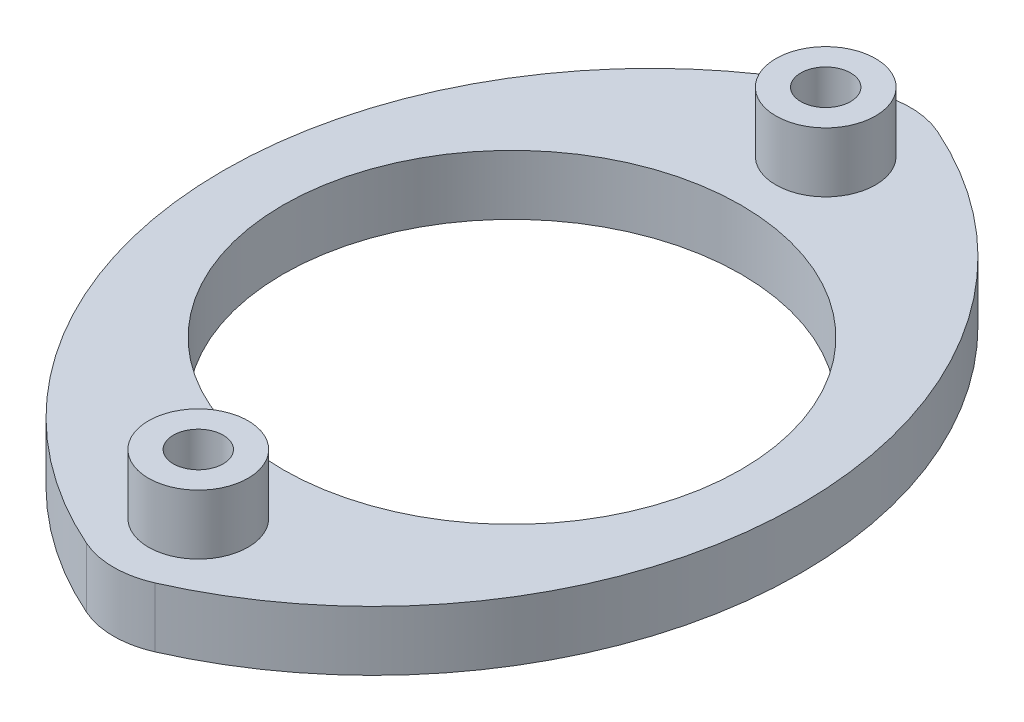
ISO-10303-21;
HEADER;
FILE_DESCRIPTION(('STEP AP214'),'2;1');
FILE_NAME('part.step','',(''),(''),'','','');
FILE_SCHEMA(('AUTOMOTIVE_DESIGN { 1 0 10303 214 1 1 1 1 }'));
ENDSEC;
DATA;
#1=APPLICATION_CONTEXT('core data for automotive mechanical design processes');
#2=APPLICATION_PROTOCOL_DEFINITION('international standard','automotive_design',2000,#1);
#3=PRODUCT_CONTEXT('',#1,'mechanical');
#4=PRODUCT('Part','Part','',(#3));
#5=PRODUCT_RELATED_PRODUCT_CATEGORY('part','',(#4));
#6=PRODUCT_DEFINITION_FORMATION('','',#4);
#7=PRODUCT_DEFINITION_CONTEXT('part definition',#1,'design');
#8=PRODUCT_DEFINITION('design','',#6,#7);
#9=PRODUCT_DEFINITION_SHAPE('','',#8);
#10=(LENGTH_UNIT() NAMED_UNIT(*) SI_UNIT(.MILLI.,.METRE.));
#11=(NAMED_UNIT(*) PLANE_ANGLE_UNIT() SI_UNIT($,.RADIAN.));
#12=(NAMED_UNIT(*) SI_UNIT($,.STERADIAN.) SOLID_ANGLE_UNIT());
#13=UNCERTAINTY_MEASURE_WITH_UNIT(LENGTH_MEASURE(1.E-05),#10,'distance_accuracy_value','');
#14=(GEOMETRIC_REPRESENTATION_CONTEXT(3) GLOBAL_UNCERTAINTY_ASSIGNED_CONTEXT((#13)) GLOBAL_UNIT_ASSIGNED_CONTEXT((#10,
#11,#12)) REPRESENTATION_CONTEXT('',''));
#15=CARTESIAN_POINT('',(0.,0.,0.));
#16=DIRECTION('',(0.,0.,1.));
#17=DIRECTION('',(1.,0.,0.));
#18=AXIS2_PLACEMENT_3D('',#15,#16,#17);
#19=CARTESIAN_POINT('',(0.,3.,0.));
#20=DIRECTION('',(0.,1.,0.));
#21=DIRECTION('',(0.,0.,1.));
#22=AXIS2_PLACEMENT_3D('',#19,#20,#21);
#23=PLANE('',#22);
#24=CARTESIAN_POINT('',(0.,3.,-15.75));
#25=DIRECTION('',(0.,1.,0.));
#26=DIRECTION('',(0.,0.,1.));
#27=AXIS2_PLACEMENT_3D('',#24,#25,#26);
#28=CIRCLE('',#27,2.5);
#29=CARTESIAN_POINT('',(0.,3.,-13.25));
#30=VERTEX_POINT('',#29);
#31=EDGE_CURVE('E104',#30,#30,#28,.F.);
#32=ORIENTED_EDGE('',*,*,#31,.T.);
#33=EDGE_LOOP('',(#32));
#34=FACE_BOUND('',#33,.T.);
#35=CARTESIAN_POINT('',(-6.97560975609756,3.,0.));
#36=DIRECTION('',(0.,1.,0.));
#37=DIRECTION('',(0.,0.,1.));
#38=AXIS2_PLACEMENT_3D('',#35,#36,#37);
#39=CIRCLE('',#38,21.4756097560976);
#40=CARTESIAN_POINT('',(1.72106194690265,3.,-19.6359292035398));
#41=VERTEX_POINT('',#40);
#42=CARTESIAN_POINT('',(1.72106194690265,3.,19.6359292035398));
#43=VERTEX_POINT('',#42);
#44=EDGE_CURVE('E84',#41,#43,#39,.F.);
#45=ORIENTED_EDGE('',*,*,#44,.F.);
#46=CARTESIAN_POINT('',(0.,3.,-15.75));
#47=DIRECTION('',(0.,1.,0.));
#48=DIRECTION('',(0.,0.,1.));
#49=AXIS2_PLACEMENT_3D('',#46,#47,#48);
#50=CIRCLE('',#49,4.25);
#51=CARTESIAN_POINT('',(-1.72106194690265,3.,-19.6359292035398));
#52=VERTEX_POINT('',#51);
#53=EDGE_CURVE('E78',#41,#52,#50,.T.);
#54=ORIENTED_EDGE('',*,*,#53,.T.);
#55=CARTESIAN_POINT('',(6.97560975609756,3.,0.));
#56=DIRECTION('',(0.,1.,0.));
#57=DIRECTION('',(0.,0.,1.));
#58=AXIS2_PLACEMENT_3D('',#55,#56,#57);
#59=CIRCLE('',#58,21.4756097560976);
#60=CARTESIAN_POINT('',(-1.72106194690266,3.,19.6359292035398));
#61=VERTEX_POINT('',#60);
#62=EDGE_CURVE('E83',#52,#61,#59,.T.);
#63=ORIENTED_EDGE('',*,*,#62,.T.);
#64=CARTESIAN_POINT('',(0.,3.,15.75));
#65=DIRECTION('',(0.,1.,0.));
#66=DIRECTION('',(0.,0.,1.));
#67=AXIS2_PLACEMENT_3D('',#64,#65,#66);
#68=CIRCLE('',#67,4.25);
#69=EDGE_CURVE('E94',#43,#61,#68,.F.);
#70=ORIENTED_EDGE('',*,*,#69,.F.);
#71=EDGE_LOOP('',(#45,#54,#63,#70));
#72=FACE_BOUND('',#71,.T.);
#73=CARTESIAN_POINT('',(0.,3.,0.));
#74=DIRECTION('',(0.,1.,0.));
#75=DIRECTION('',(0.,0.,1.));
#76=AXIS2_PLACEMENT_3D('',#73,#74,#75);
#77=CIRCLE('',#76,11.5);
#78=CARTESIAN_POINT('',(0.,3.,11.5));
#79=VERTEX_POINT('',#78);
#80=EDGE_CURVE('E96',#79,#79,#77,.T.);
#81=ORIENTED_EDGE('',*,*,#80,.F.);
#82=EDGE_LOOP('',(#81));
#83=FACE_BOUND('',#82,.T.);
#84=CARTESIAN_POINT('',(0.,3.,15.75));
#85=DIRECTION('',(0.,1.,0.));
#86=DIRECTION('',(0.,0.,1.));
#87=AXIS2_PLACEMENT_3D('',#84,#85,#86);
#88=CIRCLE('',#87,2.5);
#89=CARTESIAN_POINT('',(0.,3.,18.25));
#90=VERTEX_POINT('',#89);
#91=EDGE_CURVE('E132',#90,#90,#88,.F.);
#92=ORIENTED_EDGE('',*,*,#91,.T.);
#93=EDGE_LOOP('',(#92));
#94=FACE_BOUND('',#93,.T.);
#95=ADVANCED_FACE('F35',(#34,#72,#83,#94),#23,.T.);
#96=CARTESIAN_POINT('',(-6.97560975609756,3.,0.));
#97=DIRECTION('',(0.,-1.,0.));
#98=DIRECTION('',(0.,0.,-1.));
#99=AXIS2_PLACEMENT_3D('',#96,#97,#98);
#100=CYLINDRICAL_SURFACE('',#99,21.4756097560976);
#101=CARTESIAN_POINT('',(-6.97560975609756,0.,0.));
#102=DIRECTION('',(0.,1.,0.));
#103=DIRECTION('',(0.,0.,1.));
#104=AXIS2_PLACEMENT_3D('',#101,#102,#103);
#105=CIRCLE('',#104,21.4756097560976);
#106=CARTESIAN_POINT('',(1.72106194690265,0.,-19.6359292035398));
#107=VERTEX_POINT('',#106);
#108=CARTESIAN_POINT('',(1.72106194690265,0.,19.6359292035398));
#109=VERTEX_POINT('',#108);
#110=EDGE_CURVE('E102',#107,#109,#105,.F.);
#111=ORIENTED_EDGE('',*,*,#110,.F.);
#112=DIRECTION('',(0.,-1.,0.));
#113=VECTOR('',#112,1.);
#114=CARTESIAN_POINT('',(1.72106194690265,3.,-19.6359292035398));
#115=LINE('',#114,#113);
#116=EDGE_CURVE('E11',#41,#107,#115,.T.);
#117=ORIENTED_EDGE('',*,*,#116,.F.);
#118=ORIENTED_EDGE('',*,*,#44,.T.);
#119=DIRECTION('',(0.,-1.,0.));
#120=VECTOR('',#119,1.);
#121=CARTESIAN_POINT('',(1.72106194690265,3.,19.6359292035398));
#122=LINE('',#121,#120);
#123=EDGE_CURVE('E52',#43,#109,#122,.T.);
#124=ORIENTED_EDGE('',*,*,#123,.T.);
#125=EDGE_LOOP('',(#111,#117,#118,#124));
#126=FACE_BOUND('',#125,.T.);
#127=ADVANCED_FACE('F37',(#126),#100,.T.);
#128=CARTESIAN_POINT('',(0.,3.,-15.75));
#129=DIRECTION('',(0.,-1.,0.));
#130=DIRECTION('',(0.,0.,-1.));
#131=AXIS2_PLACEMENT_3D('',#128,#129,#130);
#132=CYLINDRICAL_SURFACE('',#131,4.25);
#133=CARTESIAN_POINT('',(0.,0.,-15.75));
#134=DIRECTION('',(0.,1.,0.));
#135=DIRECTION('',(0.,0.,1.));
#136=AXIS2_PLACEMENT_3D('',#133,#134,#135);
#137=CIRCLE('',#136,4.25);
#138=CARTESIAN_POINT('',(-1.72106194690265,0.,-19.6359292035398));
#139=VERTEX_POINT('',#138);
#140=EDGE_CURVE('E90',#107,#139,#137,.T.);
#141=ORIENTED_EDGE('',*,*,#140,.T.);
#142=DIRECTION('',(0.,-1.,0.));
#143=VECTOR('',#142,1.);
#144=CARTESIAN_POINT('',(-1.72106194690265,3.,-19.6359292035398));
#145=LINE('',#144,#143);
#146=EDGE_CURVE('E44',#52,#139,#145,.T.);
#147=ORIENTED_EDGE('',*,*,#146,.F.);
#148=ORIENTED_EDGE('',*,*,#53,.F.);
#149=ORIENTED_EDGE('',*,*,#116,.T.);
#150=EDGE_LOOP('',(#141,#147,#148,#149));
#151=FACE_BOUND('',#150,.T.);
#152=ADVANCED_FACE('F88',(#151),#132,.T.);
#153=CARTESIAN_POINT('',(6.97560975609756,3.,0.));
#154=DIRECTION('',(0.,-1.,0.));
#155=DIRECTION('',(0.,0.,-1.));
#156=AXIS2_PLACEMENT_3D('',#153,#154,#155);
#157=CYLINDRICAL_SURFACE('',#156,21.4756097560976);
#158=CARTESIAN_POINT('',(6.97560975609756,0.,0.));
#159=DIRECTION('',(0.,1.,0.));
#160=DIRECTION('',(0.,0.,1.));
#161=AXIS2_PLACEMENT_3D('',#158,#159,#160);
#162=CIRCLE('',#161,21.4756097560976);
#163=CARTESIAN_POINT('',(-1.72106194690266,0.,19.6359292035398));
#164=VERTEX_POINT('',#163);
#165=EDGE_CURVE('E106',#139,#164,#162,.T.);
#166=ORIENTED_EDGE('',*,*,#165,.T.);
#167=DIRECTION('',(0.,-1.,0.));
#168=VECTOR('',#167,1.);
#169=CARTESIAN_POINT('',(-1.72106194690266,3.,19.6359292035398));
#170=LINE('',#169,#168);
#171=EDGE_CURVE('E66',#61,#164,#170,.T.);
#172=ORIENTED_EDGE('',*,*,#171,.F.);
#173=ORIENTED_EDGE('',*,*,#62,.F.);
#174=ORIENTED_EDGE('',*,*,#146,.T.);
#175=EDGE_LOOP('',(#166,#172,#173,#174));
#176=FACE_BOUND('',#175,.T.);
#177=ADVANCED_FACE('F93',(#176),#157,.T.);
#178=CARTESIAN_POINT('',(0.,3.,15.75));
#179=DIRECTION('',(0.,-1.,0.));
#180=DIRECTION('',(0.,0.,-1.));
#181=AXIS2_PLACEMENT_3D('',#178,#179,#180);
#182=CYLINDRICAL_SURFACE('',#181,1.25);
#183=CARTESIAN_POINT('',(0.,0.,15.75));
#184=DIRECTION('',(0.,1.,0.));
#185=DIRECTION('',(0.,0.,1.));
#186=AXIS2_PLACEMENT_3D('',#183,#184,#185);
#187=CIRCLE('',#186,1.25);
#188=CARTESIAN_POINT('',(0.,0.,17.));
#189=VERTEX_POINT('',#188);
#190=EDGE_CURVE('E114',#189,#189,#187,.F.);
#191=ORIENTED_EDGE('',*,*,#190,.T.);
#192=EDGE_LOOP('',(#191));
#193=FACE_BOUND('',#192,.T.);
#194=CARTESIAN_POINT('',(0.,6.,15.75));
#195=DIRECTION('',(0.,1.,0.));
#196=DIRECTION('',(0.,0.,1.));
#197=AXIS2_PLACEMENT_3D('',#194,#195,#196);
#198=CIRCLE('',#197,1.25);
#199=CARTESIAN_POINT('',(0.,6.,17.));
#200=VERTEX_POINT('',#199);
#201=EDGE_CURVE('E138',#200,#200,#198,.T.);
#202=ORIENTED_EDGE('',*,*,#201,.T.);
#203=EDGE_LOOP('',(#202));
#204=FACE_BOUND('',#203,.T.);
#205=ADVANCED_FACE('F142',(#193,#204),#182,.F.);
#206=CARTESIAN_POINT('',(0.,3.,0.));
#207=DIRECTION('',(0.,-1.,0.));
#208=DIRECTION('',(0.,0.,-1.));
#209=AXIS2_PLACEMENT_3D('',#206,#207,#208);
#210=CYLINDRICAL_SURFACE('',#209,11.5);
#211=ORIENTED_EDGE('',*,*,#80,.T.);
#212=EDGE_LOOP('',(#211));
#213=FACE_BOUND('',#212,.T.);
#214=CARTESIAN_POINT('',(0.,0.,0.));
#215=DIRECTION('',(0.,1.,0.));
#216=DIRECTION('',(0.,0.,1.));
#217=AXIS2_PLACEMENT_3D('',#214,#215,#216);
#218=CIRCLE('',#217,11.5);
#219=CARTESIAN_POINT('',(0.,0.,11.5));
#220=VERTEX_POINT('',#219);
#221=EDGE_CURVE('E111',#220,#220,#218,.T.);
#222=ORIENTED_EDGE('',*,*,#221,.F.);
#223=EDGE_LOOP('',(#222));
#224=FACE_BOUND('',#223,.T.);
#225=ADVANCED_FACE('F178',(#213,#224),#210,.F.);
#226=CARTESIAN_POINT('',(0.,3.,15.75));
#227=DIRECTION('',(0.,-1.,0.));
#228=DIRECTION('',(0.,0.,-1.));
#229=AXIS2_PLACEMENT_3D('',#226,#227,#228);
#230=CYLINDRICAL_SURFACE('',#229,4.25);
#231=CARTESIAN_POINT('',(0.,0.,15.75));
#232=DIRECTION('',(0.,1.,0.));
#233=DIRECTION('',(0.,0.,1.));
#234=AXIS2_PLACEMENT_3D('',#231,#232,#233);
#235=CIRCLE('',#234,4.25);
#236=EDGE_CURVE('E108',#109,#164,#235,.F.);
#237=ORIENTED_EDGE('',*,*,#236,.F.);
#238=ORIENTED_EDGE('',*,*,#123,.F.);
#239=ORIENTED_EDGE('',*,*,#69,.T.);
#240=ORIENTED_EDGE('',*,*,#171,.T.);
#241=EDGE_LOOP('',(#237,#238,#239,#240));
#242=FACE_BOUND('',#241,.T.);
#243=ADVANCED_FACE('F174',(#242),#230,.T.);
#244=CARTESIAN_POINT('',(0.,3.,-15.75));
#245=DIRECTION('',(0.,-1.,0.));
#246=DIRECTION('',(0.,0.,-1.));
#247=AXIS2_PLACEMENT_3D('',#244,#245,#246);
#248=CYLINDRICAL_SURFACE('',#247,1.25);
#249=CARTESIAN_POINT('',(0.,0.,-15.75));
#250=DIRECTION('',(0.,1.,0.));
#251=DIRECTION('',(0.,0.,1.));
#252=AXIS2_PLACEMENT_3D('',#249,#250,#251);
#253=CIRCLE('',#252,1.25);
#254=CARTESIAN_POINT('',(0.,0.,-14.5));
#255=VERTEX_POINT('',#254);
#256=EDGE_CURVE('E117',#255,#255,#253,.T.);
#257=ORIENTED_EDGE('',*,*,#256,.F.);
#258=EDGE_LOOP('',(#257));
#259=FACE_BOUND('',#258,.T.);
#260=CARTESIAN_POINT('',(0.,6.,-15.75));
#261=DIRECTION('',(0.,1.,0.));
#262=DIRECTION('',(0.,0.,1.));
#263=AXIS2_PLACEMENT_3D('',#260,#261,#262);
#264=CIRCLE('',#263,1.25);
#265=CARTESIAN_POINT('',(0.,6.,-14.5));
#266=VERTEX_POINT('',#265);
#267=EDGE_CURVE('E129',#266,#266,#264,.T.);
#268=ORIENTED_EDGE('',*,*,#267,.T.);
#269=EDGE_LOOP('',(#268));
#270=FACE_BOUND('',#269,.T.);
#271=ADVANCED_FACE('F170',(#259,#270),#248,.F.);
#272=CARTESIAN_POINT('',(0.,0.,0.));
#273=DIRECTION('',(0.,1.,0.));
#274=DIRECTION('',(0.,0.,1.));
#275=AXIS2_PLACEMENT_3D('',#272,#273,#274);
#276=PLANE('',#275);
#277=ORIENTED_EDGE('',*,*,#190,.F.);
#278=EDGE_LOOP('',(#277));
#279=FACE_BOUND('',#278,.T.);
#280=ORIENTED_EDGE('',*,*,#110,.T.);
#281=ORIENTED_EDGE('',*,*,#236,.T.);
#282=ORIENTED_EDGE('',*,*,#165,.F.);
#283=ORIENTED_EDGE('',*,*,#140,.F.);
#284=EDGE_LOOP('',(#280,#281,#282,#283));
#285=FACE_BOUND('',#284,.T.);
#286=ORIENTED_EDGE('',*,*,#221,.T.);
#287=EDGE_LOOP('',(#286));
#288=FACE_BOUND('',#287,.T.);
#289=ORIENTED_EDGE('',*,*,#256,.T.);
#290=EDGE_LOOP('',(#289));
#291=FACE_BOUND('',#290,.T.);
#292=ADVANCED_FACE('F167',(#279,#285,#288,#291),#276,.F.);
#293=CARTESIAN_POINT('',(0.,6.,-15.75));
#294=DIRECTION('',(0.,1.,0.));
#295=DIRECTION('',(0.,0.,1.));
#296=AXIS2_PLACEMENT_3D('',#293,#294,#295);
#297=PLANE('',#296);
#298=CARTESIAN_POINT('',(0.,6.,-15.75));
#299=DIRECTION('',(0.,1.,0.));
#300=DIRECTION('',(0.,0.,1.));
#301=AXIS2_PLACEMENT_3D('',#298,#299,#300);
#302=CIRCLE('',#301,2.5);
#303=CARTESIAN_POINT('',(0.,6.,-13.25));
#304=VERTEX_POINT('',#303);
#305=EDGE_CURVE('E126',#304,#304,#302,.T.);
#306=ORIENTED_EDGE('',*,*,#305,.T.);
#307=EDGE_LOOP('',(#306));
#308=FACE_BOUND('',#307,.T.);
#309=ORIENTED_EDGE('',*,*,#267,.F.);
#310=EDGE_LOOP('',(#309));
#311=FACE_BOUND('',#310,.T.);
#312=ADVANCED_FACE('F156',(#308,#311),#297,.T.);
#313=CARTESIAN_POINT('',(0.,6.,-15.75));
#314=DIRECTION('',(0.,-1.,0.));
#315=DIRECTION('',(0.,0.,-1.));
#316=AXIS2_PLACEMENT_3D('',#313,#314,#315);
#317=CYLINDRICAL_SURFACE('',#316,2.5);
#318=ORIENTED_EDGE('',*,*,#31,.F.);
#319=EDGE_LOOP('',(#318));
#320=FACE_BOUND('',#319,.T.);
#321=ORIENTED_EDGE('',*,*,#305,.F.);
#322=EDGE_LOOP('',(#321));
#323=FACE_BOUND('',#322,.T.);
#324=ADVANCED_FACE('F147',(#320,#323),#317,.T.);
#325=CARTESIAN_POINT('',(0.,6.,15.75));
#326=DIRECTION('',(0.,1.,0.));
#327=DIRECTION('',(0.,0.,1.));
#328=AXIS2_PLACEMENT_3D('',#325,#326,#327);
#329=PLANE('',#328);
#330=CARTESIAN_POINT('',(0.,6.,15.75));
#331=DIRECTION('',(0.,1.,0.));
#332=DIRECTION('',(0.,0.,1.));
#333=AXIS2_PLACEMENT_3D('',#330,#331,#332);
#334=CIRCLE('',#333,2.5);
#335=CARTESIAN_POINT('',(0.,6.,18.25));
#336=VERTEX_POINT('',#335);
#337=EDGE_CURVE('E135',#336,#336,#334,.T.);
#338=ORIENTED_EDGE('',*,*,#337,.T.);
#339=EDGE_LOOP('',(#338));
#340=FACE_BOUND('',#339,.T.);
#341=ORIENTED_EDGE('',*,*,#201,.F.);
#342=EDGE_LOOP('',(#341));
#343=FACE_BOUND('',#342,.T.);
#344=ADVANCED_FACE('F144',(#340,#343),#329,.T.);
#345=CARTESIAN_POINT('',(0.,6.,15.75));
#346=DIRECTION('',(0.,-1.,0.));
#347=DIRECTION('',(0.,0.,-1.));
#348=AXIS2_PLACEMENT_3D('',#345,#346,#347);
#349=CYLINDRICAL_SURFACE('',#348,2.5);
#350=ORIENTED_EDGE('',*,*,#91,.F.);
#351=EDGE_LOOP('',(#350));
#352=FACE_BOUND('',#351,.T.);
#353=ORIENTED_EDGE('',*,*,#337,.F.);
#354=EDGE_LOOP('',(#353));
#355=FACE_BOUND('',#354,.T.);
#356=ADVANCED_FACE('F146',(#352,#355),#349,.T.);
#357=CLOSED_SHELL('',(#95,#127,#152,#177,#205,#225,#243,#271,#292,#312,#324,#344,#356));
#358=MANIFOLD_SOLID_BREP('B2',#357);
#359=ADVANCED_BREP_SHAPE_REPRESENTATION('',(#18,#358),#14);
#360=SHAPE_DEFINITION_REPRESENTATION(#9,#359);
ENDSEC;
END-ISO-10303-21;
